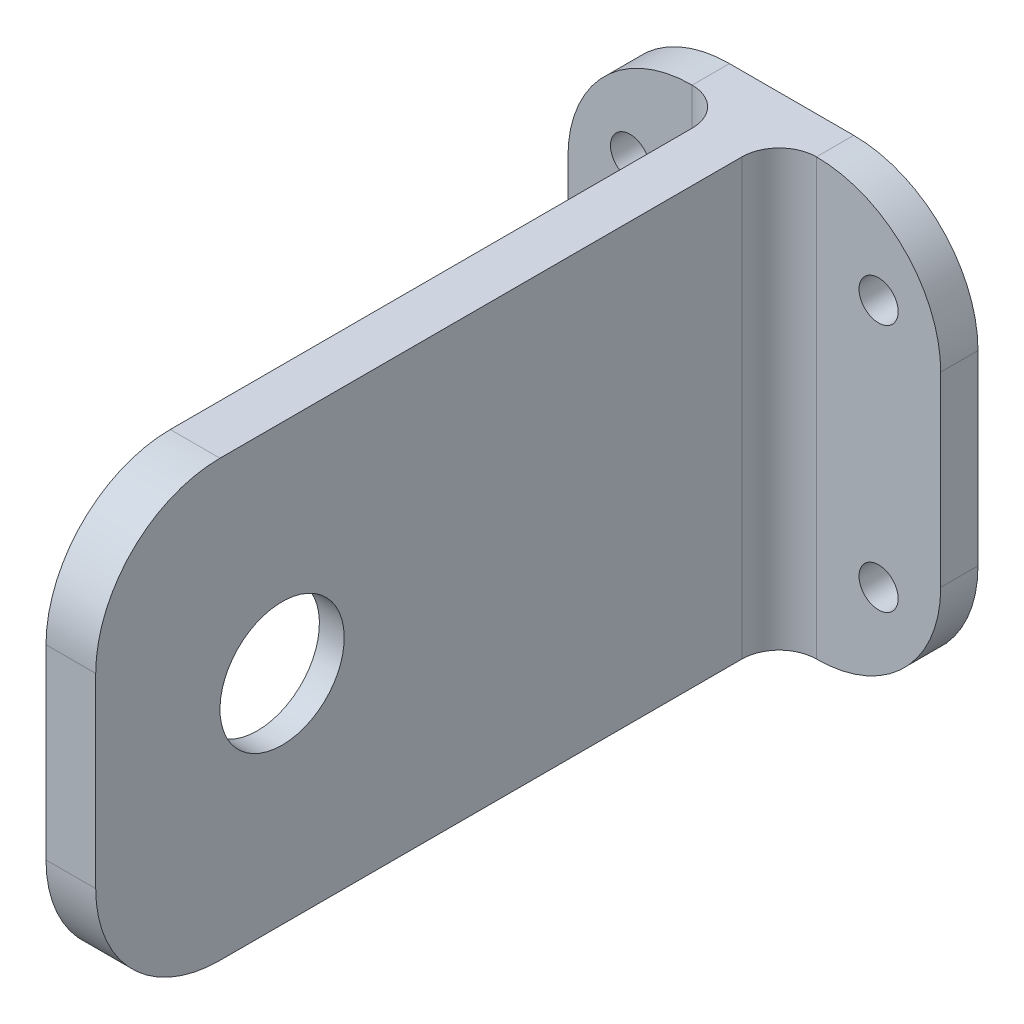
ISO-10303-21;
HEADER;
FILE_DESCRIPTION(('STEP AP214'),'2;1');
FILE_NAME('part.step','',(''),(''),'','','');
FILE_SCHEMA(('AUTOMOTIVE_DESIGN { 1 0 10303 214 1 1 1 1 }'));
ENDSEC;
DATA;
#1=APPLICATION_CONTEXT('core data for automotive mechanical design processes');
#2=APPLICATION_PROTOCOL_DEFINITION('international standard','automotive_design',2000,#1);
#3=PRODUCT_CONTEXT('',#1,'mechanical');
#4=PRODUCT('Part','Part','',(#3));
#5=PRODUCT_RELATED_PRODUCT_CATEGORY('part','',(#4));
#6=PRODUCT_DEFINITION_FORMATION('','',#4);
#7=PRODUCT_DEFINITION_CONTEXT('part definition',#1,'design');
#8=PRODUCT_DEFINITION('design','',#6,#7);
#9=PRODUCT_DEFINITION_SHAPE('','',#8);
#10=(LENGTH_UNIT() NAMED_UNIT(*) SI_UNIT(.MILLI.,.METRE.));
#11=(NAMED_UNIT(*) PLANE_ANGLE_UNIT() SI_UNIT($,.RADIAN.));
#12=(NAMED_UNIT(*) SI_UNIT($,.STERADIAN.) SOLID_ANGLE_UNIT());
#13=UNCERTAINTY_MEASURE_WITH_UNIT(LENGTH_MEASURE(1.E-05),#10,'distance_accuracy_value','');
#14=(GEOMETRIC_REPRESENTATION_CONTEXT(3) GLOBAL_UNCERTAINTY_ASSIGNED_CONTEXT((#13)) GLOBAL_UNIT_ASSIGNED_CONTEXT((#10,
#11,#12)) REPRESENTATION_CONTEXT('',''));
#15=CARTESIAN_POINT('',(0.,0.,0.));
#16=DIRECTION('',(0.,0.,1.));
#17=DIRECTION('',(1.,0.,0.));
#18=AXIS2_PLACEMENT_3D('',#15,#16,#17);
#19=CARTESIAN_POINT('',(0.,0.,3.));
#20=DIRECTION('',(0.,0.,1.));
#21=DIRECTION('',(1.,0.,0.));
#22=AXIS2_PLACEMENT_3D('',#19,#20,#21);
#23=PLANE('',#22);
#24=CARTESIAN_POINT('',(10.,-10.,3.));
#25=DIRECTION('',(0.,0.,1.));
#26=DIRECTION('',(1.,0.,0.));
#27=AXIS2_PLACEMENT_3D('',#24,#25,#26);
#28=CIRCLE('',#27,1.575);
#29=CARTESIAN_POINT('',(11.575,-10.,3.));
#30=VERTEX_POINT('',#29);
#31=EDGE_CURVE('E327',#30,#30,#28,.T.);
#32=ORIENTED_EDGE('',*,*,#31,.F.);
#33=EDGE_LOOP('',(#32));
#34=FACE_BOUND('',#33,.T.);
#35=CARTESIAN_POINT('',(10.,10.,3.));
#36=DIRECTION('',(0.,0.,1.));
#37=DIRECTION('',(1.,0.,0.));
#38=AXIS2_PLACEMENT_3D('',#35,#36,#37);
#39=CIRCLE('',#38,1.575);
#40=CARTESIAN_POINT('',(11.575,10.,3.));
#41=VERTEX_POINT('',#40);
#42=EDGE_CURVE('E171',#41,#41,#39,.T.);
#43=ORIENTED_EDGE('',*,*,#42,.F.);
#44=EDGE_LOOP('',(#43));
#45=FACE_BOUND('',#44,.T.);
#46=CARTESIAN_POINT('',(5.,7.5,3.));
#47=DIRECTION('',(0.,0.,1.));
#48=DIRECTION('',(1.,0.,0.));
#49=AXIS2_PLACEMENT_3D('',#46,#47,#48);
#50=CIRCLE('',#49,10.);
#51=CARTESIAN_POINT('',(15.,7.5,3.));
#52=VERTEX_POINT('',#51);
#53=CARTESIAN_POINT('',(5.,17.5,3.));
#54=VERTEX_POINT('',#53);
#55=EDGE_CURVE('E250',#52,#54,#50,.T.);
#56=ORIENTED_EDGE('',*,*,#55,.T.);
#57=DIRECTION('',(0.,1.,0.));
#58=VECTOR('',#57,1.);
#59=CARTESIAN_POINT('',(5.,0.,3.));
#60=LINE('',#59,#58);
#61=CARTESIAN_POINT('',(5.,-17.5,3.));
#62=VERTEX_POINT('',#61);
#63=EDGE_CURVE('E258',#54,#62,#60,.F.);
#64=ORIENTED_EDGE('',*,*,#63,.T.);
#65=CARTESIAN_POINT('',(5.,-7.5,3.));
#66=DIRECTION('',(0.,0.,1.));
#67=DIRECTION('',(1.,0.,0.));
#68=AXIS2_PLACEMENT_3D('',#65,#66,#67);
#69=CIRCLE('',#68,10.);
#70=CARTESIAN_POINT('',(15.,-7.5,3.));
#71=VERTEX_POINT('',#70);
#72=EDGE_CURVE('E253',#62,#71,#69,.T.);
#73=ORIENTED_EDGE('',*,*,#72,.T.);
#74=DIRECTION('',(0.,-1.,0.));
#75=VECTOR('',#74,1.);
#76=CARTESIAN_POINT('',(15.,0.,3.));
#77=LINE('',#76,#75);
#78=EDGE_CURVE('E184',#52,#71,#77,.T.);
#79=ORIENTED_EDGE('',*,*,#78,.F.);
#80=EDGE_LOOP('',(#56,#64,#73,#79));
#81=FACE_BOUND('',#80,.T.);
#82=ADVANCED_FACE('F34',(#34,#45,#81),#23,.T.);
#83=CARTESIAN_POINT('',(15.,0.,3.));
#84=DIRECTION('',(1.,0.,0.));
#85=DIRECTION('',(0.,1.,0.));
#86=AXIS2_PLACEMENT_3D('',#83,#84,#85);
#87=PLANE('',#86);
#88=ORIENTED_EDGE('',*,*,#78,.T.);
#89=DIRECTION('',(0.,0.,-1.));
#90=VECTOR('',#89,1.);
#91=CARTESIAN_POINT('',(15.,-7.5,0.));
#92=LINE('',#91,#90);
#93=CARTESIAN_POINT('',(15.,-7.5,0.));
#94=VERTEX_POINT('',#93);
#95=EDGE_CURVE('E247',#71,#94,#92,.T.);
#96=ORIENTED_EDGE('',*,*,#95,.T.);
#97=DIRECTION('',(0.,-1.,0.));
#98=VECTOR('',#97,1.);
#99=CARTESIAN_POINT('',(15.,0.,0.));
#100=LINE('',#99,#98);
#101=CARTESIAN_POINT('',(15.,7.5,0.));
#102=VERTEX_POINT('',#101);
#103=EDGE_CURVE('E183',#102,#94,#100,.T.);
#104=ORIENTED_EDGE('',*,*,#103,.F.);
#105=DIRECTION('',(0.,0.,-1.));
#106=VECTOR('',#105,1.);
#107=CARTESIAN_POINT('',(15.,7.5,3.));
#108=LINE('',#107,#106);
#109=EDGE_CURVE('E245',#102,#52,#108,.F.);
#110=ORIENTED_EDGE('',*,*,#109,.T.);
#111=EDGE_LOOP('',(#88,#96,#104,#110));
#112=FACE_BOUND('',#111,.T.);
#113=ADVANCED_FACE('F298',(#112),#87,.T.);
#114=CARTESIAN_POINT('',(0.,17.5,3.));
#115=DIRECTION('',(0.,1.,0.));
#116=DIRECTION('',(0.,0.,1.));
#117=AXIS2_PLACEMENT_3D('',#114,#115,#116);
#118=PLANE('',#117);
#119=DIRECTION('',(0.,0.,-1.));
#120=VECTOR('',#119,1.);
#121=CARTESIAN_POINT('',(-2.,17.5,58.));
#122=LINE('',#121,#120);
#123=CARTESIAN_POINT('',(-2.,17.5,48.));
#124=VERTEX_POINT('',#123);
#125=CARTESIAN_POINT('',(-2.,17.5,6.));
#126=VERTEX_POINT('',#125);
#127=EDGE_CURVE('E178',#124,#126,#122,.T.);
#128=ORIENTED_EDGE('',*,*,#127,.F.);
#129=DIRECTION('',(-1.,0.,0.));
#130=VECTOR('',#129,1.);
#131=CARTESIAN_POINT('',(0.,17.5,48.));
#132=LINE('',#131,#130);
#133=CARTESIAN_POINT('',(2.,17.5,48.));
#134=VERTEX_POINT('',#133);
#135=EDGE_CURVE('E146',#124,#134,#132,.F.);
#136=ORIENTED_EDGE('',*,*,#135,.T.);
#137=DIRECTION('',(0.,0.,-1.));
#138=VECTOR('',#137,1.);
#139=CARTESIAN_POINT('',(2.,17.5,58.));
#140=LINE('',#139,#138);
#141=CARTESIAN_POINT('',(2.,17.5,6.));
#142=VERTEX_POINT('',#141);
#143=EDGE_CURVE('E180',#134,#142,#140,.T.);
#144=ORIENTED_EDGE('',*,*,#143,.T.);
#145=CARTESIAN_POINT('',(5.,17.5,6.));
#146=DIRECTION('',(0.,1.,0.));
#147=DIRECTION('',(0.,0.,1.));
#148=AXIS2_PLACEMENT_3D('',#145,#146,#147);
#149=CIRCLE('',#148,3.);
#150=EDGE_CURVE('E264',#142,#54,#149,.F.);
#151=ORIENTED_EDGE('',*,*,#150,.T.);
#152=DIRECTION('',(0.,0.,-1.));
#153=VECTOR('',#152,1.);
#154=CARTESIAN_POINT('',(5.,17.5,3.));
#155=LINE('',#154,#153);
#156=CARTESIAN_POINT('',(5.,17.5,0.));
#157=VERTEX_POINT('',#156);
#158=EDGE_CURVE('E215',#54,#157,#155,.T.);
#159=ORIENTED_EDGE('',*,*,#158,.T.);
#160=DIRECTION('',(1.,0.,0.));
#161=VECTOR('',#160,1.);
#162=CARTESIAN_POINT('',(0.,17.5,0.));
#163=LINE('',#162,#161);
#164=CARTESIAN_POINT('',(-5.,17.5,0.));
#165=VERTEX_POINT('',#164);
#166=EDGE_CURVE('E192',#165,#157,#163,.T.);
#167=ORIENTED_EDGE('',*,*,#166,.F.);
#168=DIRECTION('',(0.,0.,-1.));
#169=VECTOR('',#168,1.);
#170=CARTESIAN_POINT('',(-5.,17.5,3.));
#171=LINE('',#170,#169);
#172=CARTESIAN_POINT('',(-5.,17.5,3.));
#173=VERTEX_POINT('',#172);
#174=EDGE_CURVE('E213',#165,#173,#171,.F.);
#175=ORIENTED_EDGE('',*,*,#174,.T.);
#176=CARTESIAN_POINT('',(-5.,17.5,6.));
#177=DIRECTION('',(0.,1.,0.));
#178=DIRECTION('',(0.,0.,1.));
#179=AXIS2_PLACEMENT_3D('',#176,#177,#178);
#180=CIRCLE('',#179,3.);
#181=EDGE_CURVE('E11',#173,#126,#180,.F.);
#182=ORIENTED_EDGE('',*,*,#181,.T.);
#183=EDGE_LOOP('',(#128,#136,#144,#151,#159,#167,#175,#182));
#184=FACE_BOUND('',#183,.T.);
#185=ADVANCED_FACE('F282',(#184),#118,.T.);
#186=CARTESIAN_POINT('',(-15.,0.,3.));
#187=DIRECTION('',(1.,0.,0.));
#188=DIRECTION('',(0.,1.,0.));
#189=AXIS2_PLACEMENT_3D('',#186,#187,#188);
#190=PLANE('',#189);
#191=DIRECTION('',(0.,-1.,0.));
#192=VECTOR('',#191,1.);
#193=CARTESIAN_POINT('',(-15.,0.,0.));
#194=LINE('',#193,#192);
#195=CARTESIAN_POINT('',(-15.,7.5,0.));
#196=VERTEX_POINT('',#195);
#197=CARTESIAN_POINT('',(-15.,-7.5,0.));
#198=VERTEX_POINT('',#197);
#199=EDGE_CURVE('E195',#196,#198,#194,.T.);
#200=ORIENTED_EDGE('',*,*,#199,.T.);
#201=DIRECTION('',(0.,0.,-1.));
#202=VECTOR('',#201,1.);
#203=CARTESIAN_POINT('',(-15.,-7.5,3.));
#204=LINE('',#203,#202);
#205=CARTESIAN_POINT('',(-15.,-7.5,3.));
#206=VERTEX_POINT('',#205);
#207=EDGE_CURVE('E238',#198,#206,#204,.F.);
#208=ORIENTED_EDGE('',*,*,#207,.T.);
#209=DIRECTION('',(0.,-1.,0.));
#210=VECTOR('',#209,1.);
#211=CARTESIAN_POINT('',(-15.,0.,3.));
#212=LINE('',#211,#210);
#213=CARTESIAN_POINT('',(-15.,7.5,3.));
#214=VERTEX_POINT('',#213);
#215=EDGE_CURVE('E158',#214,#206,#212,.T.);
#216=ORIENTED_EDGE('',*,*,#215,.F.);
#217=DIRECTION('',(0.,0.,-1.));
#218=VECTOR('',#217,1.);
#219=CARTESIAN_POINT('',(-15.,7.5,0.));
#220=LINE('',#219,#218);
#221=EDGE_CURVE('E235',#214,#196,#220,.T.);
#222=ORIENTED_EDGE('',*,*,#221,.T.);
#223=EDGE_LOOP('',(#200,#208,#216,#222));
#224=FACE_BOUND('',#223,.T.);
#225=ADVANCED_FACE('F317',(#224),#190,.F.);
#226=CARTESIAN_POINT('',(0.,-17.5,3.));
#227=DIRECTION('',(0.,1.,0.));
#228=DIRECTION('',(0.,0.,1.));
#229=AXIS2_PLACEMENT_3D('',#226,#227,#228);
#230=PLANE('',#229);
#231=DIRECTION('',(0.,0.,-1.));
#232=VECTOR('',#231,1.);
#233=CARTESIAN_POINT('',(2.,-17.5,58.));
#234=LINE('',#233,#232);
#235=CARTESIAN_POINT('',(2.,-17.5,48.));
#236=VERTEX_POINT('',#235);
#237=CARTESIAN_POINT('',(2.,-17.5,6.));
#238=VERTEX_POINT('',#237);
#239=EDGE_CURVE('E165',#236,#238,#234,.T.);
#240=ORIENTED_EDGE('',*,*,#239,.F.);
#241=DIRECTION('',(1.,0.,0.));
#242=VECTOR('',#241,1.);
#243=CARTESIAN_POINT('',(-2.,-17.5,48.));
#244=LINE('',#243,#242);
#245=CARTESIAN_POINT('',(-2.,-17.5,48.));
#246=VERTEX_POINT('',#245);
#247=EDGE_CURVE('E140',#236,#246,#244,.F.);
#248=ORIENTED_EDGE('',*,*,#247,.T.);
#249=DIRECTION('',(0.,0.,-1.));
#250=VECTOR('',#249,1.);
#251=CARTESIAN_POINT('',(-2.,-17.5,58.));
#252=LINE('',#251,#250);
#253=CARTESIAN_POINT('',(-2.,-17.5,6.));
#254=VERTEX_POINT('',#253);
#255=EDGE_CURVE('E175',#246,#254,#252,.T.);
#256=ORIENTED_EDGE('',*,*,#255,.T.);
#257=CARTESIAN_POINT('',(-5.,-17.5,6.));
#258=DIRECTION('',(0.,1.,0.));
#259=DIRECTION('',(0.,0.,1.));
#260=AXIS2_PLACEMENT_3D('',#257,#258,#259);
#261=CIRCLE('',#260,3.);
#262=CARTESIAN_POINT('',(-5.,-17.5,3.));
#263=VERTEX_POINT('',#262);
#264=EDGE_CURVE('E42',#254,#263,#261,.T.);
#265=ORIENTED_EDGE('',*,*,#264,.T.);
#266=DIRECTION('',(0.,0.,-1.));
#267=VECTOR('',#266,1.);
#268=CARTESIAN_POINT('',(-5.,-17.5,3.));
#269=LINE('',#268,#267);
#270=CARTESIAN_POINT('',(-5.,-17.5,0.));
#271=VERTEX_POINT('',#270);
#272=EDGE_CURVE('E223',#263,#271,#269,.T.);
#273=ORIENTED_EDGE('',*,*,#272,.T.);
#274=DIRECTION('',(1.,0.,0.));
#275=VECTOR('',#274,1.);
#276=CARTESIAN_POINT('',(0.,-17.5,0.));
#277=LINE('',#276,#275);
#278=CARTESIAN_POINT('',(5.,-17.5,0.));
#279=VERTEX_POINT('',#278);
#280=EDGE_CURVE('E187',#271,#279,#277,.T.);
#281=ORIENTED_EDGE('',*,*,#280,.T.);
#282=DIRECTION('',(0.,0.,-1.));
#283=VECTOR('',#282,1.);
#284=CARTESIAN_POINT('',(5.,-17.5,3.));
#285=LINE('',#284,#283);
#286=EDGE_CURVE('E220',#279,#62,#285,.F.);
#287=ORIENTED_EDGE('',*,*,#286,.T.);
#288=CARTESIAN_POINT('',(5.,-17.5,6.));
#289=DIRECTION('',(0.,1.,0.));
#290=DIRECTION('',(0.,0.,1.));
#291=AXIS2_PLACEMENT_3D('',#288,#289,#290);
#292=CIRCLE('',#291,3.);
#293=EDGE_CURVE('E266',#62,#238,#292,.T.);
#294=ORIENTED_EDGE('',*,*,#293,.T.);
#295=EDGE_LOOP('',(#240,#248,#256,#265,#273,#281,#287,#294));
#296=FACE_BOUND('',#295,.T.);
#297=ADVANCED_FACE('F268',(#296),#230,.F.);
#298=CARTESIAN_POINT('',(-10.,10.,3.));
#299=DIRECTION('',(0.,0.,1.));
#300=DIRECTION('',(1.,0.,0.));
#301=AXIS2_PLACEMENT_3D('',#298,#299,#300);
#302=CIRCLE('',#301,1.575);
#303=CARTESIAN_POINT('',(-8.425,10.,3.));
#304=VERTEX_POINT('',#303);
#305=EDGE_CURVE('E322',#304,#304,#302,.T.);
#306=ORIENTED_EDGE('',*,*,#305,.F.);
#307=EDGE_LOOP('',(#306));
#308=FACE_BOUND('',#307,.T.);
#309=CARTESIAN_POINT('',(-10.,-10.,3.));
#310=DIRECTION('',(0.,0.,1.));
#311=DIRECTION('',(1.,0.,0.));
#312=AXIS2_PLACEMENT_3D('',#309,#310,#311);
#313=CIRCLE('',#312,1.575);
#314=CARTESIAN_POINT('',(-8.425,-10.,3.));
#315=VERTEX_POINT('',#314);
#316=EDGE_CURVE('E325',#315,#315,#313,.T.);
#317=ORIENTED_EDGE('',*,*,#316,.F.);
#318=EDGE_LOOP('',(#317));
#319=FACE_BOUND('',#318,.T.);
#320=CARTESIAN_POINT('',(-5.,-7.5,3.));
#321=DIRECTION('',(0.,0.,1.));
#322=DIRECTION('',(1.,0.,0.));
#323=AXIS2_PLACEMENT_3D('',#320,#321,#322);
#324=CIRCLE('',#323,10.);
#325=EDGE_CURVE('E242',#206,#263,#324,.T.);
#326=ORIENTED_EDGE('',*,*,#325,.T.);
#327=DIRECTION('',(0.,-1.,0.));
#328=VECTOR('',#327,1.);
#329=CARTESIAN_POINT('',(-5.,0.,3.));
#330=LINE('',#329,#328);
#331=EDGE_CURVE('E262',#263,#173,#330,.F.);
#332=ORIENTED_EDGE('',*,*,#331,.T.);
#333=CARTESIAN_POINT('',(-5.,7.5,3.));
#334=DIRECTION('',(0.,0.,1.));
#335=DIRECTION('',(1.,0.,0.));
#336=AXIS2_PLACEMENT_3D('',#333,#334,#335);
#337=CIRCLE('',#336,10.);
#338=EDGE_CURVE('E240',#173,#214,#337,.T.);
#339=ORIENTED_EDGE('',*,*,#338,.T.);
#340=ORIENTED_EDGE('',*,*,#215,.T.);
#341=EDGE_LOOP('',(#326,#332,#339,#340));
#342=FACE_BOUND('',#341,.T.);
#343=ADVANCED_FACE('F274',(#308,#319,#342),#23,.T.);
#344=CARTESIAN_POINT('',(0.,0.,0.));
#345=DIRECTION('',(0.,0.,1.));
#346=DIRECTION('',(1.,0.,0.));
#347=AXIS2_PLACEMENT_3D('',#344,#345,#346);
#348=PLANE('',#347);
#349=CARTESIAN_POINT('',(-10.,10.,0.));
#350=DIRECTION('',(0.,0.,1.));
#351=DIRECTION('',(1.,0.,0.));
#352=AXIS2_PLACEMENT_3D('',#349,#350,#351);
#353=CIRCLE('',#352,1.575);
#354=CARTESIAN_POINT('',(-8.425,10.,0.));
#355=VERTEX_POINT('',#354);
#356=EDGE_CURVE('E163',#355,#355,#353,.T.);
#357=ORIENTED_EDGE('',*,*,#356,.T.);
#358=EDGE_LOOP('',(#357));
#359=FACE_BOUND('',#358,.T.);
#360=CARTESIAN_POINT('',(-10.,-10.,0.));
#361=DIRECTION('',(0.,0.,1.));
#362=DIRECTION('',(1.,0.,0.));
#363=AXIS2_PLACEMENT_3D('',#360,#361,#362);
#364=CIRCLE('',#363,1.575);
#365=CARTESIAN_POINT('',(-8.425,-10.,0.));
#366=VERTEX_POINT('',#365);
#367=EDGE_CURVE('E168',#366,#366,#364,.T.);
#368=ORIENTED_EDGE('',*,*,#367,.T.);
#369=EDGE_LOOP('',(#368));
#370=FACE_BOUND('',#369,.T.);
#371=CARTESIAN_POINT('',(10.,-10.,0.));
#372=DIRECTION('',(0.,0.,1.));
#373=DIRECTION('',(1.,0.,0.));
#374=AXIS2_PLACEMENT_3D('',#371,#372,#373);
#375=CIRCLE('',#374,1.575);
#376=CARTESIAN_POINT('',(11.575,-10.,0.));
#377=VERTEX_POINT('',#376);
#378=EDGE_CURVE('E203',#377,#377,#375,.T.);
#379=ORIENTED_EDGE('',*,*,#378,.T.);
#380=EDGE_LOOP('',(#379));
#381=FACE_BOUND('',#380,.T.);
#382=CARTESIAN_POINT('',(10.,10.,0.));
#383=DIRECTION('',(0.,0.,1.));
#384=DIRECTION('',(1.,0.,0.));
#385=AXIS2_PLACEMENT_3D('',#382,#383,#384);
#386=CIRCLE('',#385,1.575);
#387=CARTESIAN_POINT('',(11.575,10.,0.));
#388=VERTEX_POINT('',#387);
#389=EDGE_CURVE('E200',#388,#388,#386,.T.);
#390=ORIENTED_EDGE('',*,*,#389,.T.);
#391=EDGE_LOOP('',(#390));
#392=FACE_BOUND('',#391,.T.);
#393=ORIENTED_EDGE('',*,*,#280,.F.);
#394=CARTESIAN_POINT('',(-5.,-7.5,0.));
#395=DIRECTION('',(0.,0.,1.));
#396=DIRECTION('',(1.,0.,0.));
#397=AXIS2_PLACEMENT_3D('',#394,#395,#396);
#398=CIRCLE('',#397,10.);
#399=EDGE_CURVE('E233',#271,#198,#398,.F.);
#400=ORIENTED_EDGE('',*,*,#399,.T.);
#401=ORIENTED_EDGE('',*,*,#199,.F.);
#402=CARTESIAN_POINT('',(-5.,7.5,0.));
#403=DIRECTION('',(0.,0.,1.));
#404=DIRECTION('',(1.,0.,0.));
#405=AXIS2_PLACEMENT_3D('',#402,#403,#404);
#406=CIRCLE('',#405,10.);
#407=EDGE_CURVE('E227',#196,#165,#406,.F.);
#408=ORIENTED_EDGE('',*,*,#407,.T.);
#409=ORIENTED_EDGE('',*,*,#166,.T.);
#410=CARTESIAN_POINT('',(5.,7.5,0.));
#411=DIRECTION('',(0.,0.,1.));
#412=DIRECTION('',(1.,0.,0.));
#413=AXIS2_PLACEMENT_3D('',#410,#411,#412);
#414=CIRCLE('',#413,10.);
#415=EDGE_CURVE('E229',#157,#102,#414,.F.);
#416=ORIENTED_EDGE('',*,*,#415,.T.);
#417=ORIENTED_EDGE('',*,*,#103,.T.);
#418=CARTESIAN_POINT('',(5.,-7.5,0.));
#419=DIRECTION('',(0.,0.,1.));
#420=DIRECTION('',(1.,0.,0.));
#421=AXIS2_PLACEMENT_3D('',#418,#419,#420);
#422=CIRCLE('',#421,10.);
#423=EDGE_CURVE('E231',#94,#279,#422,.F.);
#424=ORIENTED_EDGE('',*,*,#423,.T.);
#425=EDGE_LOOP('',(#393,#400,#401,#408,#409,#416,#417,#424));
#426=FACE_BOUND('',#425,.T.);
#427=ADVANCED_FACE('F310',(#359,#370,#381,#392,#426),#348,.F.);
#428=CARTESIAN_POINT('',(2.,17.5,58.));
#429=DIRECTION('',(-1.,0.,0.));
#430=DIRECTION('',(0.,-1.,0.));
#431=AXIS2_PLACEMENT_3D('',#428,#429,#430);
#432=PLANE('',#431);
#433=CARTESIAN_POINT('',(2.,0.,43.));
#434=DIRECTION('',(-1.,0.,0.));
#435=DIRECTION('',(0.,-1.,0.));
#436=AXIS2_PLACEMENT_3D('',#433,#434,#435);
#437=CIRCLE('',#436,5.);
#438=CARTESIAN_POINT('',(2.,-5.,43.));
#439=VERTEX_POINT('',#438);
#440=EDGE_CURVE('E336',#439,#439,#437,.T.);
#441=ORIENTED_EDGE('',*,*,#440,.T.);
#442=EDGE_LOOP('',(#441));
#443=FACE_BOUND('',#442,.T.);
#444=ORIENTED_EDGE('',*,*,#239,.T.);
#445=DIRECTION('',(0.,1.,0.));
#446=VECTOR('',#445,1.);
#447=CARTESIAN_POINT('',(2.,17.5,6.));
#448=LINE('',#447,#446);
#449=EDGE_CURVE('E255',#238,#142,#448,.T.);
#450=ORIENTED_EDGE('',*,*,#449,.T.);
#451=ORIENTED_EDGE('',*,*,#143,.F.);
#452=CARTESIAN_POINT('',(2.,7.5,48.));
#453=DIRECTION('',(-1.,0.,0.));
#454=DIRECTION('',(0.,-1.,0.));
#455=AXIS2_PLACEMENT_3D('',#452,#453,#454);
#456=CIRCLE('',#455,10.);
#457=CARTESIAN_POINT('',(2.,7.5,58.));
#458=VERTEX_POINT('',#457);
#459=EDGE_CURVE('E145',#134,#458,#456,.F.);
#460=ORIENTED_EDGE('',*,*,#459,.T.);
#461=DIRECTION('',(0.,1.,0.));
#462=VECTOR('',#461,1.);
#463=CARTESIAN_POINT('',(2.,17.5,58.));
#464=LINE('',#463,#462);
#465=CARTESIAN_POINT('',(2.,-7.5,58.));
#466=VERTEX_POINT('',#465);
#467=EDGE_CURVE('E153',#466,#458,#464,.T.);
#468=ORIENTED_EDGE('',*,*,#467,.F.);
#469=CARTESIAN_POINT('',(2.,-7.5,48.));
#470=DIRECTION('',(-1.,0.,0.));
#471=DIRECTION('',(0.,-1.,0.));
#472=AXIS2_PLACEMENT_3D('',#469,#470,#471);
#473=CIRCLE('',#472,10.);
#474=EDGE_CURVE('E135',#466,#236,#473,.F.);
#475=ORIENTED_EDGE('',*,*,#474,.T.);
#476=EDGE_LOOP('',(#444,#450,#451,#460,#468,#475));
#477=FACE_BOUND('',#476,.T.);
#478=ADVANCED_FACE('F160',(#443,#477),#432,.F.);
#479=CARTESIAN_POINT('',(-2.,17.5,58.));
#480=DIRECTION('',(1.,0.,0.));
#481=DIRECTION('',(0.,1.,0.));
#482=AXIS2_PLACEMENT_3D('',#479,#480,#481);
#483=PLANE('',#482);
#484=CARTESIAN_POINT('',(-2.,0.,43.));
#485=DIRECTION('',(-1.,0.,0.));
#486=DIRECTION('',(0.,-1.,0.));
#487=AXIS2_PLACEMENT_3D('',#484,#485,#486);
#488=CIRCLE('',#487,11.);
#489=CARTESIAN_POINT('',(-2.,-11.,43.));
#490=VERTEX_POINT('',#489);
#491=EDGE_CURVE('E333',#490,#490,#488,.T.);
#492=ORIENTED_EDGE('',*,*,#491,.F.);
#493=EDGE_LOOP('',(#492));
#494=FACE_BOUND('',#493,.T.);
#495=ORIENTED_EDGE('',*,*,#127,.T.);
#496=DIRECTION('',(0.,-1.,0.));
#497=VECTOR('',#496,1.);
#498=CARTESIAN_POINT('',(-2.,17.5,6.));
#499=LINE('',#498,#497);
#500=EDGE_CURVE('E260',#126,#254,#499,.T.);
#501=ORIENTED_EDGE('',*,*,#500,.T.);
#502=ORIENTED_EDGE('',*,*,#255,.F.);
#503=CARTESIAN_POINT('',(-2.,-7.5,48.));
#504=DIRECTION('',(1.,0.,0.));
#505=DIRECTION('',(0.,1.,0.));
#506=AXIS2_PLACEMENT_3D('',#503,#504,#505);
#507=CIRCLE('',#506,10.);
#508=CARTESIAN_POINT('',(-2.,-7.5,58.));
#509=VERTEX_POINT('',#508);
#510=EDGE_CURVE('E209',#246,#509,#507,.F.);
#511=ORIENTED_EDGE('',*,*,#510,.T.);
#512=DIRECTION('',(0.,-1.,0.));
#513=VECTOR('',#512,1.);
#514=CARTESIAN_POINT('',(-2.,17.5,58.));
#515=LINE('',#514,#513);
#516=CARTESIAN_POINT('',(-2.,7.5,58.));
#517=VERTEX_POINT('',#516);
#518=EDGE_CURVE('E156',#517,#509,#515,.T.);
#519=ORIENTED_EDGE('',*,*,#518,.F.);
#520=CARTESIAN_POINT('',(-2.,7.5,48.));
#521=DIRECTION('',(1.,0.,0.));
#522=DIRECTION('',(0.,1.,0.));
#523=AXIS2_PLACEMENT_3D('',#520,#521,#522);
#524=CIRCLE('',#523,10.);
#525=EDGE_CURVE('E211',#517,#124,#524,.F.);
#526=ORIENTED_EDGE('',*,*,#525,.T.);
#527=EDGE_LOOP('',(#495,#501,#502,#511,#519,#526));
#528=FACE_BOUND('',#527,.T.);
#529=ADVANCED_FACE('F280',(#494,#528),#483,.F.);
#530=CARTESIAN_POINT('',(0.,0.,58.));
#531=DIRECTION('',(0.,0.,1.));
#532=DIRECTION('',(1.,0.,0.));
#533=AXIS2_PLACEMENT_3D('',#530,#531,#532);
#534=PLANE('',#533);
#535=ORIENTED_EDGE('',*,*,#467,.T.);
#536=DIRECTION('',(-1.,0.,0.));
#537=VECTOR('',#536,1.);
#538=CARTESIAN_POINT('',(0.,7.5,58.));
#539=LINE('',#538,#537);
#540=EDGE_CURVE('E157',#458,#517,#539,.T.);
#541=ORIENTED_EDGE('',*,*,#540,.T.);
#542=ORIENTED_EDGE('',*,*,#518,.T.);
#543=DIRECTION('',(1.,0.,0.));
#544=VECTOR('',#543,1.);
#545=CARTESIAN_POINT('',(2.,-7.5,58.));
#546=LINE('',#545,#544);
#547=EDGE_CURVE('E139',#509,#466,#546,.T.);
#548=ORIENTED_EDGE('',*,*,#547,.T.);
#549=EDGE_LOOP('',(#535,#541,#542,#548));
#550=FACE_BOUND('',#549,.T.);
#551=ADVANCED_FACE('F151',(#550),#534,.T.);
#552=CARTESIAN_POINT('',(10.,10.,-52.));
#553=DIRECTION('',(0.,0.,1.));
#554=DIRECTION('',(1.,0.,0.));
#555=AXIS2_PLACEMENT_3D('',#552,#553,#554);
#556=CYLINDRICAL_SURFACE('',#555,1.575);
#557=ORIENTED_EDGE('',*,*,#42,.T.);
#558=EDGE_LOOP('',(#557));
#559=FACE_BOUND('',#558,.T.);
#560=ORIENTED_EDGE('',*,*,#389,.F.);
#561=EDGE_LOOP('',(#560));
#562=FACE_BOUND('',#561,.T.);
#563=ADVANCED_FACE('F372',(#559,#562),#556,.F.);
#564=CARTESIAN_POINT('',(10.,-10.,-52.));
#565=DIRECTION('',(0.,0.,1.));
#566=DIRECTION('',(1.,0.,0.));
#567=AXIS2_PLACEMENT_3D('',#564,#565,#566);
#568=CYLINDRICAL_SURFACE('',#567,1.575);
#569=ORIENTED_EDGE('',*,*,#31,.T.);
#570=EDGE_LOOP('',(#569));
#571=FACE_BOUND('',#570,.T.);
#572=ORIENTED_EDGE('',*,*,#378,.F.);
#573=EDGE_LOOP('',(#572));
#574=FACE_BOUND('',#573,.T.);
#575=ADVANCED_FACE('F376',(#571,#574),#568,.F.);
#576=CARTESIAN_POINT('',(-10.,-10.,-52.));
#577=DIRECTION('',(0.,0.,1.));
#578=DIRECTION('',(1.,0.,0.));
#579=AXIS2_PLACEMENT_3D('',#576,#577,#578);
#580=CYLINDRICAL_SURFACE('',#579,1.575);
#581=ORIENTED_EDGE('',*,*,#316,.T.);
#582=EDGE_LOOP('',(#581));
#583=FACE_BOUND('',#582,.T.);
#584=ORIENTED_EDGE('',*,*,#367,.F.);
#585=EDGE_LOOP('',(#584));
#586=FACE_BOUND('',#585,.T.);
#587=ADVANCED_FACE('F293',(#583,#586),#580,.F.);
#588=CARTESIAN_POINT('',(-10.,10.,-52.));
#589=DIRECTION('',(0.,0.,1.));
#590=DIRECTION('',(1.,0.,0.));
#591=AXIS2_PLACEMENT_3D('',#588,#589,#590);
#592=CYLINDRICAL_SURFACE('',#591,1.575);
#593=ORIENTED_EDGE('',*,*,#305,.T.);
#594=EDGE_LOOP('',(#593));
#595=FACE_BOUND('',#594,.T.);
#596=ORIENTED_EDGE('',*,*,#356,.F.);
#597=EDGE_LOOP('',(#596));
#598=FACE_BOUND('',#597,.T.);
#599=ADVANCED_FACE('F286',(#595,#598),#592,.F.);
#600=CARTESIAN_POINT('',(0.,7.5,48.));
#601=DIRECTION('',(-1.,0.,0.));
#602=DIRECTION('',(0.,0.,1.));
#603=AXIS2_PLACEMENT_3D('',#600,#601,#602);
#604=CYLINDRICAL_SURFACE('',#603,10.);
#605=ORIENTED_EDGE('',*,*,#459,.F.);
#606=ORIENTED_EDGE('',*,*,#135,.F.);
#607=ORIENTED_EDGE('',*,*,#525,.F.);
#608=ORIENTED_EDGE('',*,*,#540,.F.);
#609=EDGE_LOOP('',(#605,#606,#607,#608));
#610=FACE_BOUND('',#609,.T.);
#611=ADVANCED_FACE('F284',(#610),#604,.T.);
#612=CARTESIAN_POINT('',(0.,-7.5,48.));
#613=DIRECTION('',(-1.,0.,0.));
#614=DIRECTION('',(0.,0.,1.));
#615=AXIS2_PLACEMENT_3D('',#612,#613,#614);
#616=CYLINDRICAL_SURFACE('',#615,10.);
#617=ORIENTED_EDGE('',*,*,#510,.F.);
#618=ORIENTED_EDGE('',*,*,#247,.F.);
#619=ORIENTED_EDGE('',*,*,#474,.F.);
#620=ORIENTED_EDGE('',*,*,#547,.F.);
#621=EDGE_LOOP('',(#617,#618,#619,#620));
#622=FACE_BOUND('',#621,.T.);
#623=ADVANCED_FACE('F138',(#622),#616,.T.);
#624=CARTESIAN_POINT('',(-5.,-7.5,3.));
#625=DIRECTION('',(0.,0.,-1.));
#626=DIRECTION('',(-1.,0.,0.));
#627=AXIS2_PLACEMENT_3D('',#624,#625,#626);
#628=CYLINDRICAL_SURFACE('',#627,10.);
#629=ORIENTED_EDGE('',*,*,#325,.F.);
#630=ORIENTED_EDGE('',*,*,#207,.F.);
#631=ORIENTED_EDGE('',*,*,#399,.F.);
#632=ORIENTED_EDGE('',*,*,#272,.F.);
#633=EDGE_LOOP('',(#629,#630,#631,#632));
#634=FACE_BOUND('',#633,.T.);
#635=ADVANCED_FACE('F278',(#634),#628,.T.);
#636=CARTESIAN_POINT('',(5.,-7.5,3.));
#637=DIRECTION('',(0.,0.,1.));
#638=DIRECTION('',(1.,0.,0.));
#639=AXIS2_PLACEMENT_3D('',#636,#637,#638);
#640=CYLINDRICAL_SURFACE('',#639,10.);
#641=ORIENTED_EDGE('',*,*,#72,.F.);
#642=ORIENTED_EDGE('',*,*,#286,.F.);
#643=ORIENTED_EDGE('',*,*,#423,.F.);
#644=ORIENTED_EDGE('',*,*,#95,.F.);
#645=EDGE_LOOP('',(#641,#642,#643,#644));
#646=FACE_BOUND('',#645,.T.);
#647=ADVANCED_FACE('F395',(#646),#640,.T.);
#648=CARTESIAN_POINT('',(5.,7.5,3.));
#649=DIRECTION('',(0.,0.,-1.));
#650=DIRECTION('',(-1.,0.,0.));
#651=AXIS2_PLACEMENT_3D('',#648,#649,#650);
#652=CYLINDRICAL_SURFACE('',#651,10.);
#653=ORIENTED_EDGE('',*,*,#55,.F.);
#654=ORIENTED_EDGE('',*,*,#109,.F.);
#655=ORIENTED_EDGE('',*,*,#415,.F.);
#656=ORIENTED_EDGE('',*,*,#158,.F.);
#657=EDGE_LOOP('',(#653,#654,#655,#656));
#658=FACE_BOUND('',#657,.T.);
#659=ADVANCED_FACE('F408',(#658),#652,.T.);
#660=CARTESIAN_POINT('',(-5.,7.5,3.));
#661=DIRECTION('',(0.,0.,1.));
#662=DIRECTION('',(1.,0.,0.));
#663=AXIS2_PLACEMENT_3D('',#660,#661,#662);
#664=CYLINDRICAL_SURFACE('',#663,10.);
#665=ORIENTED_EDGE('',*,*,#338,.F.);
#666=ORIENTED_EDGE('',*,*,#174,.F.);
#667=ORIENTED_EDGE('',*,*,#407,.F.);
#668=ORIENTED_EDGE('',*,*,#221,.F.);
#669=EDGE_LOOP('',(#665,#666,#667,#668));
#670=FACE_BOUND('',#669,.T.);
#671=ADVANCED_FACE('F362',(#670),#664,.T.);
#672=CARTESIAN_POINT('',(0.,0.,43.));
#673=DIRECTION('',(-1.,0.,0.));
#674=DIRECTION('',(0.,-1.,0.));
#675=AXIS2_PLACEMENT_3D('',#672,#673,#674);
#676=CYLINDRICAL_SURFACE('',#675,11.);
#677=CARTESIAN_POINT('',(0.,0.,43.));
#678=DIRECTION('',(-1.,0.,0.));
#679=DIRECTION('',(0.,-1.,0.));
#680=AXIS2_PLACEMENT_3D('',#677,#678,#679);
#681=CIRCLE('',#680,11.);
#682=CARTESIAN_POINT('',(0.,-11.,43.));
#683=VERTEX_POINT('',#682);
#684=EDGE_CURVE('E331',#683,#683,#681,.T.);
#685=ORIENTED_EDGE('',*,*,#684,.F.);
#686=EDGE_LOOP('',(#685));
#687=FACE_BOUND('',#686,.T.);
#688=ORIENTED_EDGE('',*,*,#491,.T.);
#689=EDGE_LOOP('',(#688));
#690=FACE_BOUND('',#689,.T.);
#691=ADVANCED_FACE('F356',(#687,#690),#676,.F.);
#692=CARTESIAN_POINT('',(0.,0.,43.));
#693=DIRECTION('',(-1.,0.,0.));
#694=DIRECTION('',(0.,-1.,0.));
#695=AXIS2_PLACEMENT_3D('',#692,#693,#694);
#696=PLANE('',#695);
#697=CARTESIAN_POINT('',(0.,0.,43.));
#698=DIRECTION('',(-1.,0.,0.));
#699=DIRECTION('',(0.,-1.,0.));
#700=AXIS2_PLACEMENT_3D('',#697,#698,#699);
#701=CIRCLE('',#700,5.);
#702=CARTESIAN_POINT('',(0.,-5.,43.));
#703=VERTEX_POINT('',#702);
#704=EDGE_CURVE('E339',#703,#703,#701,.T.);
#705=ORIENTED_EDGE('',*,*,#704,.F.);
#706=EDGE_LOOP('',(#705));
#707=FACE_BOUND('',#706,.T.);
#708=ORIENTED_EDGE('',*,*,#684,.T.);
#709=EDGE_LOOP('',(#708));
#710=FACE_BOUND('',#709,.T.);
#711=ADVANCED_FACE('F350',(#707,#710),#696,.T.);
#712=CARTESIAN_POINT('',(2.,0.,43.));
#713=DIRECTION('',(-1.,0.,0.));
#714=DIRECTION('',(0.,-1.,0.));
#715=AXIS2_PLACEMENT_3D('',#712,#713,#714);
#716=CYLINDRICAL_SURFACE('',#715,5.);
#717=ORIENTED_EDGE('',*,*,#440,.F.);
#718=EDGE_LOOP('',(#717));
#719=FACE_BOUND('',#718,.T.);
#720=ORIENTED_EDGE('',*,*,#704,.T.);
#721=EDGE_LOOP('',(#720));
#722=FACE_BOUND('',#721,.T.);
#723=ADVANCED_FACE('F346',(#719,#722),#716,.F.);
#724=CARTESIAN_POINT('',(5.,17.5,6.));
#725=DIRECTION('',(0.,1.,0.));
#726=DIRECTION('',(-1.,0.,0.));
#727=AXIS2_PLACEMENT_3D('',#724,#725,#726);
#728=CYLINDRICAL_SURFACE('',#727,3.);
#729=ORIENTED_EDGE('',*,*,#293,.F.);
#730=ORIENTED_EDGE('',*,*,#63,.F.);
#731=ORIENTED_EDGE('',*,*,#150,.F.);
#732=ORIENTED_EDGE('',*,*,#449,.F.);
#733=EDGE_LOOP('',(#729,#730,#731,#732));
#734=FACE_BOUND('',#733,.T.);
#735=ADVANCED_FACE('F349',(#734),#728,.F.);
#736=CARTESIAN_POINT('',(-5.,17.5,6.));
#737=DIRECTION('',(0.,-1.,0.));
#738=DIRECTION('',(1.,0.,0.));
#739=AXIS2_PLACEMENT_3D('',#736,#737,#738);
#740=CYLINDRICAL_SURFACE('',#739,3.);
#741=ORIENTED_EDGE('',*,*,#181,.F.);
#742=ORIENTED_EDGE('',*,*,#331,.F.);
#743=ORIENTED_EDGE('',*,*,#264,.F.);
#744=ORIENTED_EDGE('',*,*,#500,.F.);
#745=EDGE_LOOP('',(#741,#742,#743,#744));
#746=FACE_BOUND('',#745,.T.);
#747=ADVANCED_FACE('F36',(#746),#740,.F.);
#748=CLOSED_SHELL('',(#82,#113,#185,#225,#297,#343,#427,#478,#529,#551,#563,#575,#587,#599,#611,
#623,#635,#647,#659,#671,#691,#711,#723,#735,#747));
#749=MANIFOLD_SOLID_BREP('B2',#748);
#750=ADVANCED_BREP_SHAPE_REPRESENTATION('',(#18,#749),#14);
#751=SHAPE_DEFINITION_REPRESENTATION(#9,#750);
ENDSEC;
END-ISO-10303-21;
